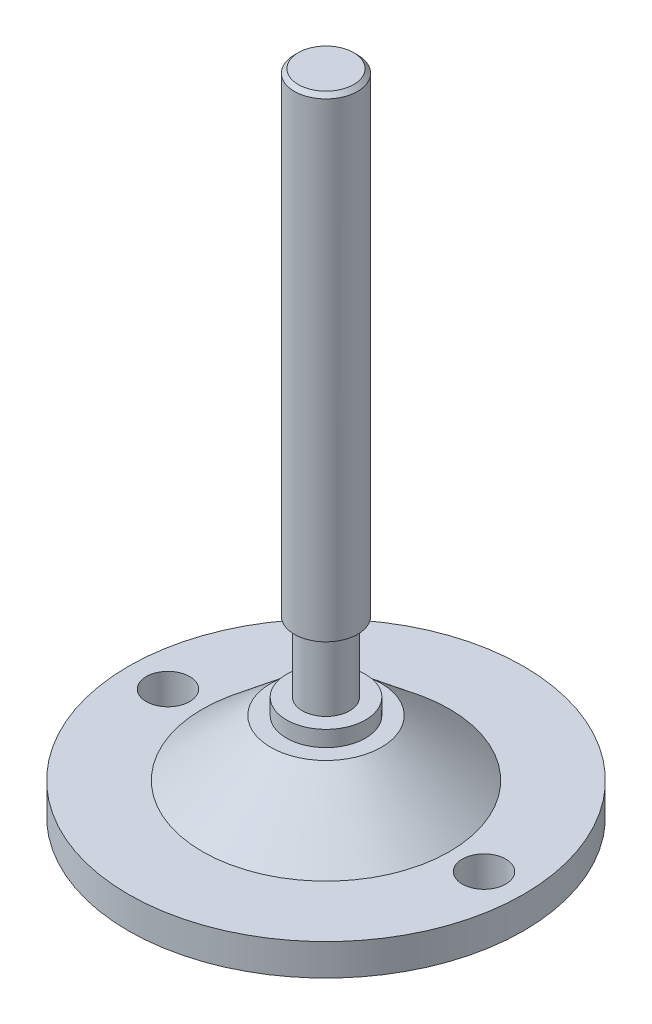
ISO-10303-21;
HEADER;
FILE_DESCRIPTION(('STEP AP214'),'2;1');
FILE_NAME('part.step','',(''),(''),'','','');
FILE_SCHEMA(('AUTOMOTIVE_DESIGN { 1 0 10303 214 1 1 1 1 }'));
ENDSEC;
DATA;
#1=APPLICATION_CONTEXT('core data for automotive mechanical design processes');
#2=APPLICATION_PROTOCOL_DEFINITION('international standard','automotive_design',2000,#1);
#3=PRODUCT_CONTEXT('',#1,'mechanical');
#4=PRODUCT('Part','Part','',(#3));
#5=PRODUCT_RELATED_PRODUCT_CATEGORY('part','',(#4));
#6=PRODUCT_DEFINITION_FORMATION('','',#4);
#7=PRODUCT_DEFINITION_CONTEXT('part definition',#1,'design');
#8=PRODUCT_DEFINITION('design','',#6,#7);
#9=PRODUCT_DEFINITION_SHAPE('','',#8);
#10=(LENGTH_UNIT() NAMED_UNIT(*) SI_UNIT(.MILLI.,.METRE.));
#11=(NAMED_UNIT(*) PLANE_ANGLE_UNIT() SI_UNIT($,.RADIAN.));
#12=(NAMED_UNIT(*) SI_UNIT($,.STERADIAN.) SOLID_ANGLE_UNIT());
#13=UNCERTAINTY_MEASURE_WITH_UNIT(LENGTH_MEASURE(1.E-05),#10,'distance_accuracy_value','');
#14=(GEOMETRIC_REPRESENTATION_CONTEXT(3) GLOBAL_UNCERTAINTY_ASSIGNED_CONTEXT((#13)) GLOBAL_UNIT_ASSIGNED_CONTEXT((#10,
#11,#12)) REPRESENTATION_CONTEXT('',''));
#15=CARTESIAN_POINT('',(0.,0.,0.));
#16=DIRECTION('',(0.,0.,1.));
#17=DIRECTION('',(1.,0.,0.));
#18=AXIS2_PLACEMENT_3D('',#15,#16,#17);
#19=CARTESIAN_POINT('',(0.,0.,0.));
#20=DIRECTION('',(0.,-1.,0.));
#21=DIRECTION('',(0.,0.,-1.));
#22=AXIS2_PLACEMENT_3D('',#19,#20,#21);
#23=PLANE('',#22);
#24=CARTESIAN_POINT('',(20.,0.,0.));
#25=DIRECTION('',(0.,-1.,0.));
#26=DIRECTION('',(0.,0.,-1.));
#27=AXIS2_PLACEMENT_3D('',#24,#25,#26);
#28=CIRCLE('',#27,2.75);
#29=CARTESIAN_POINT('',(20.,0.,-2.75));
#30=VERTEX_POINT('',#29);
#31=EDGE_CURVE('E61',#30,#30,#28,.T.);
#32=ORIENTED_EDGE('',*,*,#31,.F.);
#33=EDGE_LOOP('',(#32));
#34=FACE_BOUND('',#33,.T.);
#35=CARTESIAN_POINT('',(-20.,0.,0.));
#36=DIRECTION('',(0.,-1.,0.));
#37=DIRECTION('',(0.,0.,-1.));
#38=AXIS2_PLACEMENT_3D('',#35,#36,#37);
#39=CIRCLE('',#38,2.75);
#40=CARTESIAN_POINT('',(-20.,0.,-2.75));
#41=VERTEX_POINT('',#40);
#42=EDGE_CURVE('E50',#41,#41,#39,.T.);
#43=ORIENTED_EDGE('',*,*,#42,.F.);
#44=EDGE_LOOP('',(#43));
#45=FACE_BOUND('',#44,.T.);
#46=CARTESIAN_POINT('',(0.,0.,0.));
#47=DIRECTION('',(0.,-1.,0.));
#48=DIRECTION('',(0.,0.,-1.));
#49=AXIS2_PLACEMENT_3D('',#46,#47,#48);
#50=CIRCLE('',#49,25.);
#51=CARTESIAN_POINT('',(0.,0.,-25.));
#52=VERTEX_POINT('',#51);
#53=EDGE_CURVE('E44',#52,#52,#50,.T.);
#54=ORIENTED_EDGE('',*,*,#53,.T.);
#55=EDGE_LOOP('',(#54));
#56=FACE_BOUND('',#55,.T.);
#57=ADVANCED_FACE('F31',(#34,#45,#56),#23,.T.);
#58=CARTESIAN_POINT('',(0.,0.,0.));
#59=DIRECTION('',(0.,-1.,0.));
#60=DIRECTION('',(0.,0.,-1.));
#61=AXIS2_PLACEMENT_3D('',#58,#59,#60);
#62=CYLINDRICAL_SURFACE('',#61,25.);
#63=CARTESIAN_POINT('',(0.,4.,0.));
#64=DIRECTION('',(0.,-1.,0.));
#65=DIRECTION('',(0.,0.,-1.));
#66=AXIS2_PLACEMENT_3D('',#63,#64,#65);
#67=CIRCLE('',#66,25.);
#68=CARTESIAN_POINT('',(0.,4.,-25.));
#69=VERTEX_POINT('',#68);
#70=EDGE_CURVE('E81',#69,#69,#67,.T.);
#71=ORIENTED_EDGE('',*,*,#70,.T.);
#72=EDGE_LOOP('',(#71));
#73=FACE_BOUND('',#72,.T.);
#74=ORIENTED_EDGE('',*,*,#53,.F.);
#75=EDGE_LOOP('',(#74));
#76=FACE_BOUND('',#75,.T.);
#77=ADVANCED_FACE('F87',(#73,#76),#62,.T.);
#78=CARTESIAN_POINT('',(25.,4.,0.));
#79=DIRECTION('',(0.,1.,0.));
#80=DIRECTION('',(0.,0.,1.));
#81=AXIS2_PLACEMENT_3D('',#78,#79,#80);
#82=PLANE('',#81);
#83=CARTESIAN_POINT('',(20.,4.,0.));
#84=DIRECTION('',(0.,1.,0.));
#85=DIRECTION('',(0.,0.,1.));
#86=AXIS2_PLACEMENT_3D('',#83,#84,#85);
#87=CIRCLE('',#86,2.75);
#88=CARTESIAN_POINT('',(20.,4.,2.75));
#89=VERTEX_POINT('',#88);
#90=EDGE_CURVE('E35',#89,#89,#87,.T.);
#91=ORIENTED_EDGE('',*,*,#90,.F.);
#92=EDGE_LOOP('',(#91));
#93=FACE_BOUND('',#92,.T.);
#94=CARTESIAN_POINT('',(-20.,4.,0.));
#95=DIRECTION('',(0.,1.,0.));
#96=DIRECTION('',(0.,0.,1.));
#97=AXIS2_PLACEMENT_3D('',#94,#95,#96);
#98=CIRCLE('',#97,2.75);
#99=CARTESIAN_POINT('',(-20.,4.,2.75));
#100=VERTEX_POINT('',#99);
#101=EDGE_CURVE('E47',#100,#100,#98,.T.);
#102=ORIENTED_EDGE('',*,*,#101,.F.);
#103=EDGE_LOOP('',(#102));
#104=FACE_BOUND('',#103,.T.);
#105=CARTESIAN_POINT('',(0.,4.,0.));
#106=DIRECTION('',(0.,-1.,0.));
#107=DIRECTION('',(0.,0.,-1.));
#108=AXIS2_PLACEMENT_3D('',#105,#106,#107);
#109=CIRCLE('',#108,15.632287960712);
#110=CARTESIAN_POINT('',(0.,4.,-15.632287960712));
#111=VERTEX_POINT('',#110);
#112=EDGE_CURVE('E78',#111,#111,#109,.T.);
#113=ORIENTED_EDGE('',*,*,#112,.T.);
#114=EDGE_LOOP('',(#113));
#115=FACE_BOUND('',#114,.T.);
#116=ORIENTED_EDGE('',*,*,#70,.F.);
#117=EDGE_LOOP('',(#116));
#118=FACE_BOUND('',#117,.T.);
#119=ADVANCED_FACE('F89',(#93,#104,#115,#118),#82,.T.);
#120=CARTESIAN_POINT('',(0.,4.,0.));
#121=DIRECTION('',(0.,-1.,0.));
#122=DIRECTION('',(0.,0.,-1.));
#123=AXIS2_PLACEMENT_3D('',#120,#121,#122);
#124=CONICAL_SURFACE('',#123,15.632287960712,0.881198646772606);
#125=CARTESIAN_POINT('',(0.,11.1187022234368,0.));
#126=DIRECTION('',(0.,-1.,0.));
#127=DIRECTION('',(0.,0.,-1.));
#128=AXIS2_PLACEMENT_3D('',#125,#126,#127);
#129=CIRCLE('',#128,7.);
#130=CARTESIAN_POINT('',(0.,11.1187022234368,-7.));
#131=VERTEX_POINT('',#130);
#132=EDGE_CURVE('E75',#131,#131,#129,.T.);
#133=ORIENTED_EDGE('',*,*,#132,.T.);
#134=EDGE_LOOP('',(#133));
#135=FACE_BOUND('',#134,.T.);
#136=ORIENTED_EDGE('',*,*,#112,.F.);
#137=EDGE_LOOP('',(#136));
#138=FACE_BOUND('',#137,.T.);
#139=ADVANCED_FACE('F96',(#135,#138),#124,.T.);
#140=CARTESIAN_POINT('',(7.,11.1187022234368,0.));
#141=DIRECTION('',(0.,1.,0.));
#142=DIRECTION('',(0.,0.,1.));
#143=AXIS2_PLACEMENT_3D('',#140,#141,#142);
#144=PLANE('',#143);
#145=CARTESIAN_POINT('',(0.,11.1187022234368,0.));
#146=DIRECTION('',(0.,-1.,0.));
#147=DIRECTION('',(0.,0.,-1.));
#148=AXIS2_PLACEMENT_3D('',#145,#146,#147);
#149=CIRCLE('',#148,5.);
#150=CARTESIAN_POINT('',(0.,11.1187022234368,-5.));
#151=VERTEX_POINT('',#150);
#152=EDGE_CURVE('E72',#151,#151,#149,.T.);
#153=ORIENTED_EDGE('',*,*,#152,.T.);
#154=EDGE_LOOP('',(#153));
#155=FACE_BOUND('',#154,.T.);
#156=ORIENTED_EDGE('',*,*,#132,.F.);
#157=EDGE_LOOP('',(#156));
#158=FACE_BOUND('',#157,.T.);
#159=ADVANCED_FACE('F103',(#155,#158),#144,.T.);
#160=CARTESIAN_POINT('',(0.,0.,0.));
#161=DIRECTION('',(0.,-1.,0.));
#162=DIRECTION('',(0.,0.,-1.));
#163=AXIS2_PLACEMENT_3D('',#160,#161,#162);
#164=CYLINDRICAL_SURFACE('',#163,5.);
#165=CARTESIAN_POINT('',(0.,13.1187022234368,0.));
#166=DIRECTION('',(0.,-1.,0.));
#167=DIRECTION('',(0.,0.,-1.));
#168=AXIS2_PLACEMENT_3D('',#165,#166,#167);
#169=CIRCLE('',#168,5.);
#170=CARTESIAN_POINT('',(0.,13.1187022234368,-5.));
#171=VERTEX_POINT('',#170);
#172=EDGE_CURVE('E69',#171,#171,#169,.T.);
#173=ORIENTED_EDGE('',*,*,#172,.T.);
#174=EDGE_LOOP('',(#173));
#175=FACE_BOUND('',#174,.T.);
#176=ORIENTED_EDGE('',*,*,#152,.F.);
#177=EDGE_LOOP('',(#176));
#178=FACE_BOUND('',#177,.T.);
#179=ADVANCED_FACE('F107',(#175,#178),#164,.T.);
#180=CARTESIAN_POINT('',(5.,13.1187022234368,0.));
#181=DIRECTION('',(0.,1.,0.));
#182=DIRECTION('',(0.,0.,1.));
#183=AXIS2_PLACEMENT_3D('',#180,#181,#182);
#184=PLANE('',#183);
#185=CARTESIAN_POINT('',(0.,13.1187022234368,0.));
#186=DIRECTION('',(0.,-1.,0.));
#187=DIRECTION('',(0.,0.,-1.));
#188=AXIS2_PLACEMENT_3D('',#185,#186,#187);
#189=CIRCLE('',#188,3.);
#190=CARTESIAN_POINT('',(0.,13.1187022234368,-3.));
#191=VERTEX_POINT('',#190);
#192=EDGE_CURVE('E66',#191,#191,#189,.T.);
#193=ORIENTED_EDGE('',*,*,#192,.T.);
#194=EDGE_LOOP('',(#193));
#195=FACE_BOUND('',#194,.T.);
#196=ORIENTED_EDGE('',*,*,#172,.F.);
#197=EDGE_LOOP('',(#196));
#198=FACE_BOUND('',#197,.T.);
#199=ADVANCED_FACE('F111',(#195,#198),#184,.T.);
#200=CARTESIAN_POINT('',(0.,0.,0.));
#201=DIRECTION('',(0.,-1.,0.));
#202=DIRECTION('',(0.,0.,-1.));
#203=AXIS2_PLACEMENT_3D('',#200,#201,#202);
#204=CYLINDRICAL_SURFACE('',#203,3.);
#205=CARTESIAN_POINT('',(0.,22.,0.));
#206=DIRECTION('',(0.,-1.,0.));
#207=DIRECTION('',(0.,0.,-1.));
#208=AXIS2_PLACEMENT_3D('',#205,#206,#207);
#209=CIRCLE('',#208,3.);
#210=CARTESIAN_POINT('',(0.,22.,-3.));
#211=VERTEX_POINT('',#210);
#212=EDGE_CURVE('E54',#211,#211,#209,.T.);
#213=ORIENTED_EDGE('',*,*,#212,.T.);
#214=EDGE_LOOP('',(#213));
#215=FACE_BOUND('',#214,.T.);
#216=ORIENTED_EDGE('',*,*,#192,.F.);
#217=EDGE_LOOP('',(#216));
#218=FACE_BOUND('',#217,.T.);
#219=ADVANCED_FACE('F115',(#215,#218),#204,.T.);
#220=CARTESIAN_POINT('',(3.,22.,0.));
#221=DIRECTION('',(0.,-1.,0.));
#222=DIRECTION('',(0.,0.,-1.));
#223=AXIS2_PLACEMENT_3D('',#220,#221,#222);
#224=PLANE('',#223);
#225=CARTESIAN_POINT('',(0.,22.,0.));
#226=DIRECTION('',(0.,-1.,0.));
#227=DIRECTION('',(0.,0.,-1.));
#228=AXIS2_PLACEMENT_3D('',#225,#226,#227);
#229=CIRCLE('',#228,4.);
#230=CARTESIAN_POINT('',(0.,22.,-4.));
#231=VERTEX_POINT('',#230);
#232=EDGE_CURVE('E49',#231,#231,#229,.T.);
#233=ORIENTED_EDGE('',*,*,#232,.T.);
#234=EDGE_LOOP('',(#233));
#235=FACE_BOUND('',#234,.T.);
#236=ORIENTED_EDGE('',*,*,#212,.F.);
#237=EDGE_LOOP('',(#236));
#238=FACE_BOUND('',#237,.T.);
#239=ADVANCED_FACE('F119',(#235,#238),#224,.T.);
#240=CARTESIAN_POINT('',(0.,0.,0.));
#241=DIRECTION('',(0.,-1.,0.));
#242=DIRECTION('',(0.,0.,-1.));
#243=AXIS2_PLACEMENT_3D('',#240,#241,#242);
#244=CYLINDRICAL_SURFACE('',#243,4.);
#245=CARTESIAN_POINT('',(0.,81.5,0.));
#246=DIRECTION('',(0.,1.,0.));
#247=DIRECTION('',(0.,0.,1.));
#248=AXIS2_PLACEMENT_3D('',#245,#246,#247);
#249=CIRCLE('',#248,4.);
#250=CARTESIAN_POINT('',(0.,81.5,4.));
#251=VERTEX_POINT('',#250);
#252=EDGE_CURVE('E39',#251,#251,#249,.F.);
#253=ORIENTED_EDGE('',*,*,#252,.T.);
#254=EDGE_LOOP('',(#253));
#255=FACE_BOUND('',#254,.T.);
#256=ORIENTED_EDGE('',*,*,#232,.F.);
#257=EDGE_LOOP('',(#256));
#258=FACE_BOUND('',#257,.T.);
#259=ADVANCED_FACE('F123',(#255,#258),#244,.T.);
#260=CARTESIAN_POINT('',(4.,82.,0.));
#261=DIRECTION('',(0.,1.,0.));
#262=DIRECTION('',(0.,0.,1.));
#263=AXIS2_PLACEMENT_3D('',#260,#261,#262);
#264=PLANE('',#263);
#265=CARTESIAN_POINT('',(0.,82.,0.));
#266=DIRECTION('',(0.,1.,0.));
#267=DIRECTION('',(0.,0.,1.));
#268=AXIS2_PLACEMENT_3D('',#265,#266,#267);
#269=CIRCLE('',#268,3.5);
#270=CARTESIAN_POINT('',(0.,82.,3.5));
#271=VERTEX_POINT('',#270);
#272=EDGE_CURVE('E10',#271,#271,#269,.T.);
#273=ORIENTED_EDGE('',*,*,#272,.T.);
#274=EDGE_LOOP('',(#273));
#275=FACE_BOUND('',#274,.T.);
#276=ADVANCED_FACE('F127',(#275),#264,.T.);
#277=CARTESIAN_POINT('',(0.,81.5,0.));
#278=DIRECTION('',(0.,-1.,0.));
#279=DIRECTION('',(0.,0.,-1.));
#280=AXIS2_PLACEMENT_3D('',#277,#278,#279);
#281=CONICAL_SURFACE('',#280,4.,0.785398163397445);
#282=ORIENTED_EDGE('',*,*,#272,.F.);
#283=EDGE_LOOP('',(#282));
#284=FACE_BOUND('',#283,.T.);
#285=ORIENTED_EDGE('',*,*,#252,.F.);
#286=EDGE_LOOP('',(#285));
#287=FACE_BOUND('',#286,.T.);
#288=ADVANCED_FACE('F33',(#284,#287),#281,.T.);
#289=CARTESIAN_POINT('',(-20.,82.,0.));
#290=DIRECTION('',(0.,-1.,0.));
#291=DIRECTION('',(0.,0.,-1.));
#292=AXIS2_PLACEMENT_3D('',#289,#290,#291);
#293=CYLINDRICAL_SURFACE('',#292,2.75);
#294=ORIENTED_EDGE('',*,*,#101,.T.);
#295=EDGE_LOOP('',(#294));
#296=FACE_BOUND('',#295,.T.);
#297=ORIENTED_EDGE('',*,*,#42,.T.);
#298=EDGE_LOOP('',(#297));
#299=FACE_BOUND('',#298,.T.);
#300=ADVANCED_FACE('F131',(#296,#299),#293,.F.);
#301=CARTESIAN_POINT('',(20.,82.,0.));
#302=DIRECTION('',(0.,-1.,0.));
#303=DIRECTION('',(0.,0.,-1.));
#304=AXIS2_PLACEMENT_3D('',#301,#302,#303);
#305=CYLINDRICAL_SURFACE('',#304,2.75);
#306=ORIENTED_EDGE('',*,*,#90,.T.);
#307=EDGE_LOOP('',(#306));
#308=FACE_BOUND('',#307,.T.);
#309=ORIENTED_EDGE('',*,*,#31,.T.);
#310=EDGE_LOOP('',(#309));
#311=FACE_BOUND('',#310,.T.);
#312=ADVANCED_FACE('F134',(#308,#311),#305,.F.);
#313=CLOSED_SHELL('',(#57,#77,#119,#139,#159,#179,#199,#219,#239,#259,#276,#288,#300,#312));
#314=MANIFOLD_SOLID_BREP('B2',#313);
#315=ADVANCED_BREP_SHAPE_REPRESENTATION('',(#18,#314),#14);
#316=SHAPE_DEFINITION_REPRESENTATION(#9,#315);
ENDSEC;
END-ISO-10303-21;
